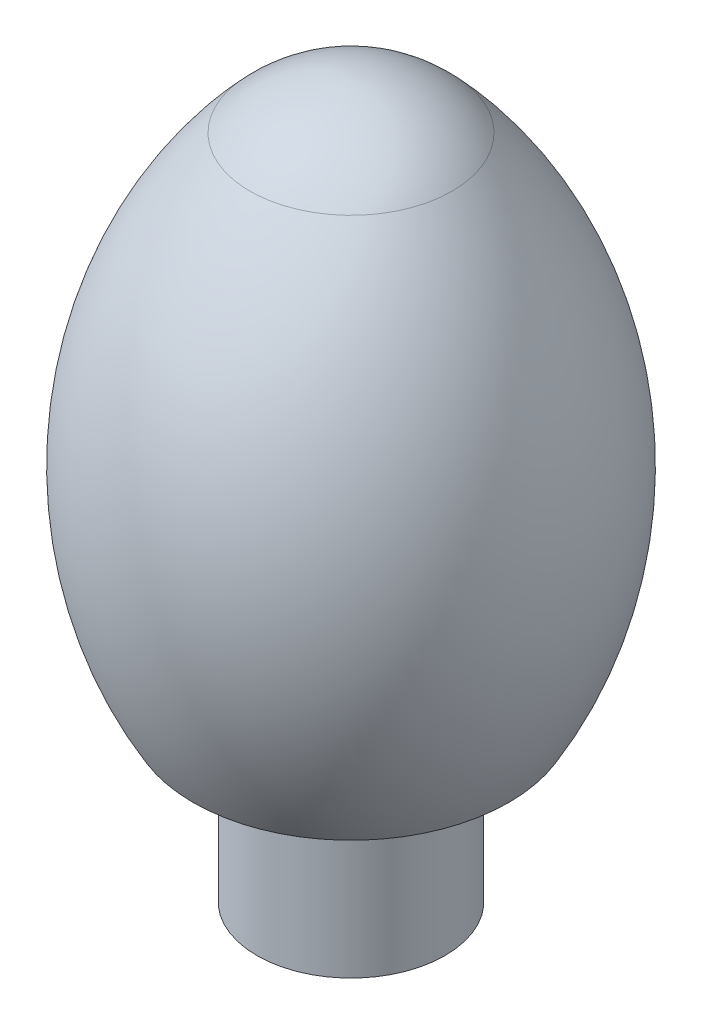
ISO-10303-21;
HEADER;
FILE_DESCRIPTION(('STEP AP214'),'2;1');
FILE_NAME('part.step','',(''),(''),'','','');
FILE_SCHEMA(('AUTOMOTIVE_DESIGN { 1 0 10303 214 1 1 1 1 }'));
ENDSEC;
DATA;
#1=APPLICATION_CONTEXT('core data for automotive mechanical design processes');
#2=APPLICATION_PROTOCOL_DEFINITION('international standard','automotive_design',2000,#1);
#3=PRODUCT_CONTEXT('',#1,'mechanical');
#4=PRODUCT('Part','Part','',(#3));
#5=PRODUCT_RELATED_PRODUCT_CATEGORY('part','',(#4));
#6=PRODUCT_DEFINITION_FORMATION('','',#4);
#7=PRODUCT_DEFINITION_CONTEXT('part definition',#1,'design');
#8=PRODUCT_DEFINITION('design','',#6,#7);
#9=PRODUCT_DEFINITION_SHAPE('','',#8);
#10=(LENGTH_UNIT() NAMED_UNIT(*) SI_UNIT(.MILLI.,.METRE.));
#11=(NAMED_UNIT(*) PLANE_ANGLE_UNIT() SI_UNIT($,.RADIAN.));
#12=(NAMED_UNIT(*) SI_UNIT($,.STERADIAN.) SOLID_ANGLE_UNIT());
#13=UNCERTAINTY_MEASURE_WITH_UNIT(LENGTH_MEASURE(1.E-05),#10,'distance_accuracy_value','');
#14=(GEOMETRIC_REPRESENTATION_CONTEXT(3) GLOBAL_UNCERTAINTY_ASSIGNED_CONTEXT((#13)) GLOBAL_UNIT_ASSIGNED_CONTEXT((#10,
#11,#12)) REPRESENTATION_CONTEXT('',''));
#15=CARTESIAN_POINT('',(0.,0.,0.));
#16=DIRECTION('',(0.,0.,1.));
#17=DIRECTION('',(1.,0.,0.));
#18=AXIS2_PLACEMENT_3D('',#15,#16,#17);
#19=CARTESIAN_POINT('',(0.,20.3713899230378,0.));
#20=DIRECTION('',(0.,-1.,0.));
#21=DIRECTION('',(1.,0.,0.));
#22=AXIS2_PLACEMENT_3D('',#19,#20,#21);
#23=DEGENERATE_TOROIDAL_SURFACE('',#22,11.1805335644238,22.8105907217335,.F.);
#24=CARTESIAN_POINT('',(0.,35.9670703962913,0.));
#25=DIRECTION('',(0.,-1.,0.));
#26=DIRECTION('',(1.,0.,0.));
#27=AXIS2_PLACEMENT_3D('',#24,#25,#26);
#28=CIRCLE('',#27,5.46572125912774);
#29=CARTESIAN_POINT('',(5.46572125912774,35.9670703962913,0.));
#30=VERTEX_POINT('',#29);
#31=EDGE_CURVE('E59',#30,#30,#28,.T.);
#32=ORIENTED_EDGE('',*,*,#31,.T.);
#33=EDGE_LOOP('',(#32));
#34=FACE_BOUND('',#33,.T.);
#35=CARTESIAN_POINT('',(0.,8.89,0.));
#36=DIRECTION('',(0.,-1.,0.));
#37=DIRECTION('',(1.,0.,0.));
#38=AXIS2_PLACEMENT_3D('',#35,#36,#37);
#39=CIRCLE('',#38,8.52988841253035);
#40=CARTESIAN_POINT('',(8.52988841253035,8.89,0.));
#41=VERTEX_POINT('',#40);
#42=EDGE_CURVE('E62',#41,#41,#39,.T.);
#43=ORIENTED_EDGE('',*,*,#42,.F.);
#44=EDGE_LOOP('',(#43));
#45=FACE_BOUND('',#44,.T.);
#46=ADVANCED_FACE('F41',(#34,#45),#23,.F.);
#47=CARTESIAN_POINT('',(-0.261740572352614,30.6010787306978,0.));
#48=DIRECTION('',(0.,0.,-1.));
#49=DIRECTION('',(1.,0.,0.));
#50=AXIS2_PLACEMENT_3D('',#47,#48,#49);
#51=CIRCLE('',#50,7.84841930494815);
#52=TRIMMED_CURVE('',#51,(PARAMETER_VALUE(-1.53744067849468)),
(PARAMETER_VALUE(1.53744067849468)),.T.,.PARAMETER.);
#53=CARTESIAN_POINT('',(0.,30.6010787306978,0.));
#54=DIRECTION('',(0.,-1.,0.));
#55=AXIS1_PLACEMENT('',#53,#54);
#56=SURFACE_OF_REVOLUTION('',#52,#55);
#57=CARTESIAN_POINT('',(0.,38.4451323676299,0.));
#58=VERTEX_POINT('',#57);
#59=VERTEX_LOOP('',#58);
#60=FACE_BOUND('',#59,.T.);
#61=ORIENTED_EDGE('',*,*,#31,.F.);
#62=EDGE_LOOP('',(#61));
#63=FACE_BOUND('',#62,.T.);
#64=ADVANCED_FACE('F52',(#60,#63),#56,.T.);
#65=CARTESIAN_POINT('',(0.,8.89,0.));
#66=DIRECTION('',(0.,-1.,0.));
#67=DIRECTION('',(1.,0.,0.));
#68=AXIS2_PLACEMENT_3D('',#65,#66,#67);
#69=PLANE('',#68);
#70=CARTESIAN_POINT('',(0.,8.89,0.));
#71=DIRECTION('',(0.,-1.,0.));
#72=DIRECTION('',(1.,0.,0.));
#73=AXIS2_PLACEMENT_3D('',#70,#71,#72);
#74=CIRCLE('',#73,5.08);
#75=CARTESIAN_POINT('',(5.08,8.89,0.));
#76=VERTEX_POINT('',#75);
#77=EDGE_CURVE('E45',#76,#76,#74,.T.);
#78=ORIENTED_EDGE('',*,*,#77,.F.);
#79=EDGE_LOOP('',(#78));
#80=FACE_BOUND('',#79,.T.);
#81=ORIENTED_EDGE('',*,*,#42,.T.);
#82=EDGE_LOOP('',(#81));
#83=FACE_BOUND('',#82,.T.);
#84=ADVANCED_FACE('F55',(#80,#83),#69,.T.);
#85=CARTESIAN_POINT('',(0.,10.16,0.));
#86=DIRECTION('',(0.,-1.,0.));
#87=DIRECTION('',(0.,0.,-1.));
#88=AXIS2_PLACEMENT_3D('',#85,#86,#87);
#89=CYLINDRICAL_SURFACE('',#88,5.08);
#90=ORIENTED_EDGE('',*,*,#77,.T.);
#91=EDGE_LOOP('',(#90));
#92=FACE_BOUND('',#91,.T.);
#93=CARTESIAN_POINT('',(0.,0.,0.));
#94=DIRECTION('',(0.,1.,0.));
#95=DIRECTION('',(0.,0.,1.));
#96=AXIS2_PLACEMENT_3D('',#93,#94,#95);
#97=CIRCLE('',#96,5.08);
#98=CARTESIAN_POINT('',(0.,0.,5.08));
#99=VERTEX_POINT('',#98);
#100=EDGE_CURVE('E11',#99,#99,#97,.T.);
#101=ORIENTED_EDGE('',*,*,#100,.T.);
#102=EDGE_LOOP('',(#101));
#103=FACE_BOUND('',#102,.T.);
#104=ADVANCED_FACE('F43',(#92,#103),#89,.T.);
#105=CARTESIAN_POINT('',(0.,0.,0.));
#106=DIRECTION('',(0.,1.,0.));
#107=DIRECTION('',(0.,0.,1.));
#108=AXIS2_PLACEMENT_3D('',#105,#106,#107);
#109=PLANE('',#108);
#110=ORIENTED_EDGE('',*,*,#100,.F.);
#111=EDGE_LOOP('',(#110));
#112=FACE_BOUND('',#111,.T.);
#113=ADVANCED_FACE('F78',(#112),#109,.F.);
#114=CLOSED_SHELL('',(#46,#64,#84,#104,#113));
#115=MANIFOLD_SOLID_BREP('B2',#114);
#116=ADVANCED_BREP_SHAPE_REPRESENTATION('',(#18,#115),#14);
#117=SHAPE_DEFINITION_REPRESENTATION(#9,#116);
ENDSEC;
END-ISO-10303-21;
